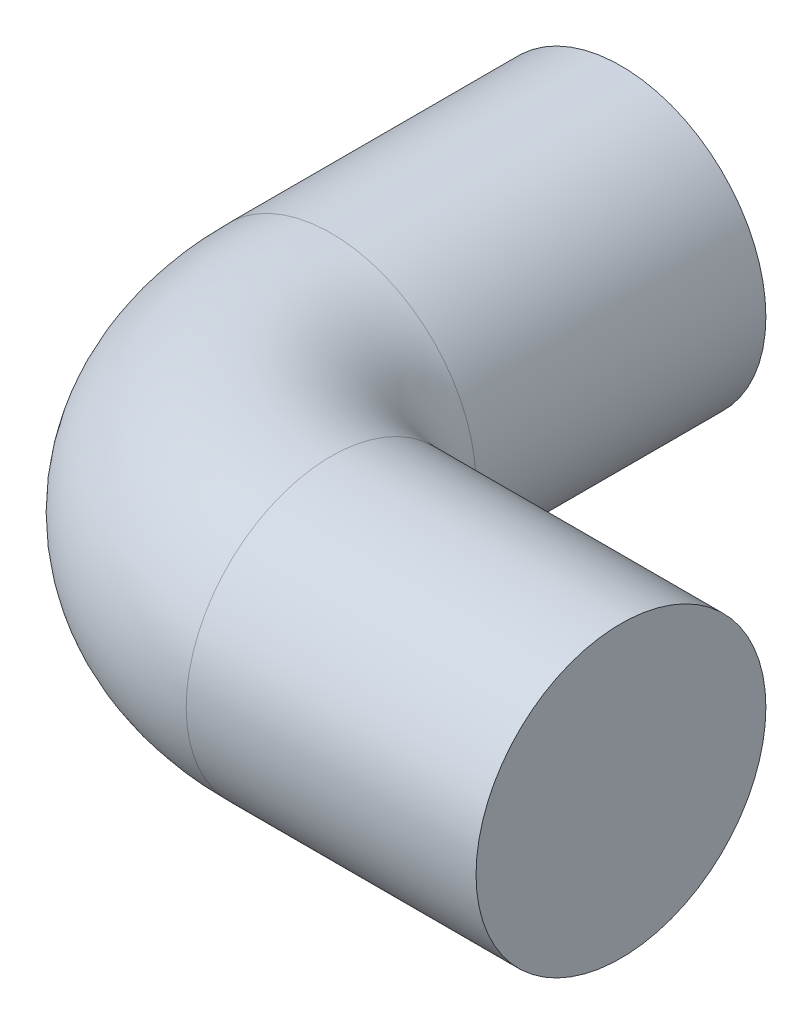
ISO-10303-21;
HEADER;
FILE_DESCRIPTION(('STEP AP214'),'2;1');
FILE_NAME('part.step','',(''),(''),'','','');
FILE_SCHEMA(('AUTOMOTIVE_DESIGN { 1 0 10303 214 1 1 1 1 }'));
ENDSEC;
DATA;
#1=APPLICATION_CONTEXT('core data for automotive mechanical design processes');
#2=APPLICATION_PROTOCOL_DEFINITION('international standard','automotive_design',2000,#1);
#3=PRODUCT_CONTEXT('',#1,'mechanical');
#4=PRODUCT('Part','Part','',(#3));
#5=PRODUCT_RELATED_PRODUCT_CATEGORY('part','',(#4));
#6=PRODUCT_DEFINITION_FORMATION('','',#4);
#7=PRODUCT_DEFINITION_CONTEXT('part definition',#1,'design');
#8=PRODUCT_DEFINITION('design','',#6,#7);
#9=PRODUCT_DEFINITION_SHAPE('','',#8);
#10=(LENGTH_UNIT() NAMED_UNIT(*) SI_UNIT(.MILLI.,.METRE.));
#11=(NAMED_UNIT(*) PLANE_ANGLE_UNIT() SI_UNIT($,.RADIAN.));
#12=(NAMED_UNIT(*) SI_UNIT($,.STERADIAN.) SOLID_ANGLE_UNIT());
#13=UNCERTAINTY_MEASURE_WITH_UNIT(LENGTH_MEASURE(1.E-05),#10,'distance_accuracy_value','');
#14=(GEOMETRIC_REPRESENTATION_CONTEXT(3) GLOBAL_UNCERTAINTY_ASSIGNED_CONTEXT((#13)) GLOBAL_UNIT_ASSIGNED_CONTEXT((#10,
#11,#12)) REPRESENTATION_CONTEXT('',''));
#15=CARTESIAN_POINT('',(0.,0.,0.));
#16=DIRECTION('',(0.,0.,1.));
#17=DIRECTION('',(1.,0.,0.));
#18=AXIS2_PLACEMENT_3D('',#15,#16,#17);
#19=CARTESIAN_POINT('',(0.,0.,0.));
#20=DIRECTION('',(1.,0.,0.));
#21=DIRECTION('',(0.,0.,-1.));
#22=AXIS2_PLACEMENT_3D('',#19,#20,#21);
#23=PLANE('',#22);
#24=CARTESIAN_POINT('',(0.,0.,0.));
#25=DIRECTION('',(1.,0.,0.));
#26=DIRECTION('',(0.,0.,-1.));
#27=AXIS2_PLACEMENT_3D('',#24,#25,#26);
#28=CIRCLE('',#27,37.5);
#29=CARTESIAN_POINT('',(0.,0.,-37.5));
#30=VERTEX_POINT('',#29);
#31=EDGE_CURVE('E70',#30,#30,#28,.T.);
#32=ORIENTED_EDGE('',*,*,#31,.T.);
#33=EDGE_LOOP('',(#32));
#34=FACE_BOUND('',#33,.T.);
#35=ADVANCED_FACE('F53',(#34),#23,.T.);
#36=CARTESIAN_POINT('',(-125.,0.,-125.));
#37=DIRECTION('',(0.,0.,1.));
#38=DIRECTION('',(1.,0.,0.));
#39=AXIS2_PLACEMENT_3D('',#36,#37,#38);
#40=PLANE('',#39);
#41=CARTESIAN_POINT('',(-125.,0.,-125.));
#42=DIRECTION('',(0.,0.,1.));
#43=DIRECTION('',(1.,0.,0.));
#44=AXIS2_PLACEMENT_3D('',#41,#42,#43);
#45=CIRCLE('',#44,37.5);
#46=CARTESIAN_POINT('',(-87.5,0.,-125.));
#47=VERTEX_POINT('',#46);
#48=EDGE_CURVE('E11',#47,#47,#45,.T.);
#49=ORIENTED_EDGE('',*,*,#48,.F.);
#50=EDGE_LOOP('',(#49));
#51=FACE_BOUND('',#50,.T.);
#52=ADVANCED_FACE('F81',(#51),#40,.F.);
#53=CARTESIAN_POINT('',(0.,0.,0.));
#54=DIRECTION('',(-1.,0.,0.));
#55=DIRECTION('',(0.,0.,1.));
#56=AXIS2_PLACEMENT_3D('',#53,#54,#55);
#57=CYLINDRICAL_SURFACE('',#56,37.5);
#58=CARTESIAN_POINT('',(-75.,0.,0.));
#59=DIRECTION('',(1.,0.,0.));
#60=DIRECTION('',(0.,0.,-1.));
#61=AXIS2_PLACEMENT_3D('',#58,#59,#60);
#62=CIRCLE('',#61,37.5);
#63=CARTESIAN_POINT('',(-75.,0.,37.5));
#64=VERTEX_POINT('',#63);
#65=EDGE_CURVE('E65',#64,#64,#62,.T.);
#66=ORIENTED_EDGE('',*,*,#65,.T.);
#67=EDGE_LOOP('',(#66));
#68=FACE_BOUND('',#67,.T.);
#69=ORIENTED_EDGE('',*,*,#31,.F.);
#70=EDGE_LOOP('',(#69));
#71=FACE_BOUND('',#70,.T.);
#72=ADVANCED_FACE('F78',(#68,#71),#57,.T.);
#73=CARTESIAN_POINT('',(-75.,0.,-50.));
#74=DIRECTION('',(0.,-1.,0.));
#75=DIRECTION('',(0.,0.,-1.));
#76=AXIS2_PLACEMENT_3D('',#73,#74,#75);
#77=TOROIDAL_SURFACE('',#76,50.,37.5);
#78=CARTESIAN_POINT('',(-125.,0.,-50.));
#79=DIRECTION('',(0.,0.,1.));
#80=DIRECTION('',(1.,0.,0.));
#81=AXIS2_PLACEMENT_3D('',#78,#79,#80);
#82=CIRCLE('',#81,37.5);
#83=CARTESIAN_POINT('',(-162.5,0.,-50.));
#84=VERTEX_POINT('',#83);
#85=EDGE_CURVE('E60',#84,#84,#82,.T.);
#86=CARTESIAN_POINT('',(-75.,0.,-50.));
#87=DIRECTION('',(0.,-1.,0.));
#88=DIRECTION('',(0.,0.,-1.));
#89=AXIS2_PLACEMENT_3D('',#86,#87,#88);
#90=CIRCLE('',#89,87.5);
#91=EDGE_CURVE('',#64,#84,#90,.T.);
#92=ORIENTED_EDGE('',*,*,#65,.F.);
#93=ORIENTED_EDGE('',*,*,#85,.T.);
#94=ORIENTED_EDGE('',*,*,#91,.T.);
#95=ORIENTED_EDGE('',*,*,#91,.F.);
#96=EDGE_LOOP('',(#92,#94,#93,#95));
#97=FACE_BOUND('',#96,.T.);
#98=ADVANCED_FACE('F80',(#97),#77,.T.);
#99=CARTESIAN_POINT('',(-125.,0.,-50.));
#100=DIRECTION('',(0.,0.,-1.));
#101=DIRECTION('',(-1.,0.,0.));
#102=AXIS2_PLACEMENT_3D('',#99,#100,#101);
#103=CYLINDRICAL_SURFACE('',#102,37.5);
#104=ORIENTED_EDGE('',*,*,#48,.T.);
#105=EDGE_LOOP('',(#104));
#106=FACE_BOUND('',#105,.T.);
#107=ORIENTED_EDGE('',*,*,#85,.F.);
#108=EDGE_LOOP('',(#107));
#109=FACE_BOUND('',#108,.T.);
#110=ADVANCED_FACE('F88',(#106,#109),#103,.T.);
#111=CLOSED_SHELL('',(#35,#52,#72,#98,#110));
#112=MANIFOLD_SOLID_BREP('B2',#111);
#113=ADVANCED_BREP_SHAPE_REPRESENTATION('',(#18,#112),#14);
#114=SHAPE_DEFINITION_REPRESENTATION(#9,#113);
ENDSEC;
END-ISO-10303-21;
